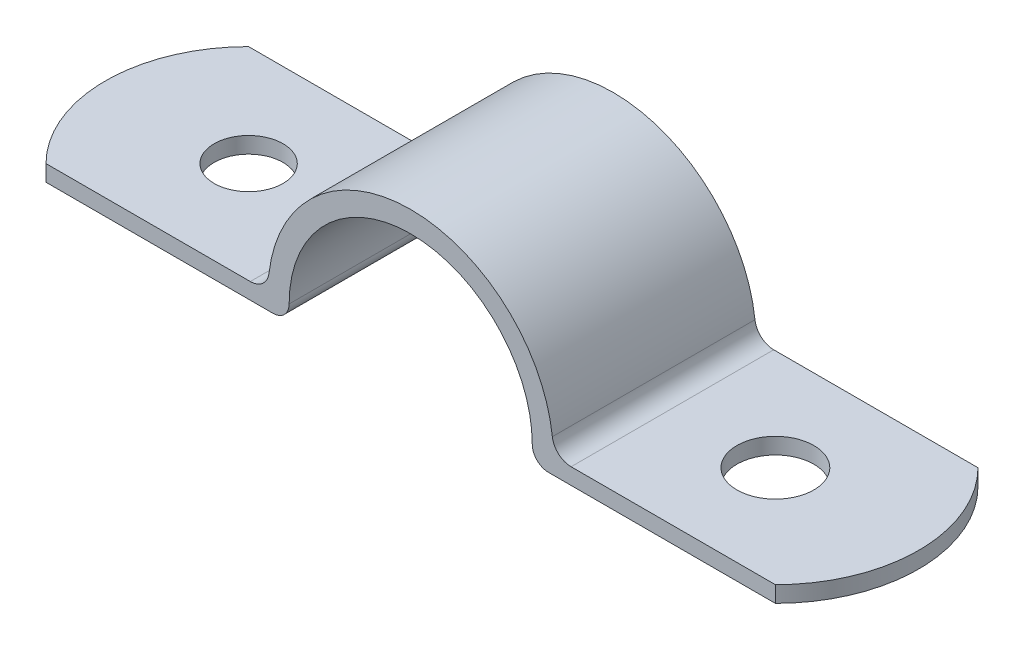
ISO-10303-21;
HEADER;
FILE_DESCRIPTION(('STEP AP214'),'2;1');
FILE_NAME('part.step','',(''),(''),'','','');
FILE_SCHEMA(('AUTOMOTIVE_DESIGN { 1 0 10303 214 1 1 1 1 }'));
ENDSEC;
DATA;
#1=APPLICATION_CONTEXT('core data for automotive mechanical design processes');
#2=APPLICATION_PROTOCOL_DEFINITION('international standard','automotive_design',2000,#1);
#3=PRODUCT_CONTEXT('',#1,'mechanical');
#4=PRODUCT('Part','Part','',(#3));
#5=PRODUCT_RELATED_PRODUCT_CATEGORY('part','',(#4));
#6=PRODUCT_DEFINITION_FORMATION('','',#4);
#7=PRODUCT_DEFINITION_CONTEXT('part definition',#1,'design');
#8=PRODUCT_DEFINITION('design','',#6,#7);
#9=PRODUCT_DEFINITION_SHAPE('','',#8);
#10=(LENGTH_UNIT() NAMED_UNIT(*) SI_UNIT(.MILLI.,.METRE.));
#11=(NAMED_UNIT(*) PLANE_ANGLE_UNIT() SI_UNIT($,.RADIAN.));
#12=(NAMED_UNIT(*) SI_UNIT($,.STERADIAN.) SOLID_ANGLE_UNIT());
#13=UNCERTAINTY_MEASURE_WITH_UNIT(LENGTH_MEASURE(1.E-05),#10,'distance_accuracy_value','');
#14=(GEOMETRIC_REPRESENTATION_CONTEXT(3) GLOBAL_UNCERTAINTY_ASSIGNED_CONTEXT((#13)) GLOBAL_UNIT_ASSIGNED_CONTEXT((#10,
#11,#12)) REPRESENTATION_CONTEXT('',''));
#15=CARTESIAN_POINT('',(0.,0.,0.));
#16=DIRECTION('',(0.,0.,1.));
#17=DIRECTION('',(1.,0.,0.));
#18=AXIS2_PLACEMENT_3D('',#15,#16,#17);
#19=CARTESIAN_POINT('',(0.,0.8,10.));
#20=DIRECTION('',(0.,0.,-1.));
#21=DIRECTION('',(-1.,0.,0.));
#22=AXIS2_PLACEMENT_3D('',#19,#20,#21);
#23=PLANE('',#22);
#24=CARTESIAN_POINT('',(24.8,0.8,10.));
#25=DIRECTION('',(0.,0.,1.));
#26=DIRECTION('',(1.,0.,0.));
#27=AXIS2_PLACEMENT_3D('',#24,#25,#26);
#28=CIRCLE('',#27,0.799999999999999);
#29=CARTESIAN_POINT('',(24.,0.8,10.));
#30=VERTEX_POINT('',#29);
#31=CARTESIAN_POINT('',(24.8,0.,10.));
#32=VERTEX_POINT('',#31);
#33=EDGE_CURVE('E142',#30,#32,#28,.T.);
#34=ORIENTED_EDGE('',*,*,#33,.T.);
#35=DIRECTION('',(1.,0.,0.));
#36=VECTOR('',#35,1.);
#37=CARTESIAN_POINT('',(24.,0.,10.));
#38=LINE('',#37,#36);
#39=CARTESIAN_POINT('',(36.,0.,10.));
#40=VERTEX_POINT('',#39);
#41=EDGE_CURVE('E151',#32,#40,#38,.T.);
#42=ORIENTED_EDGE('',*,*,#41,.T.);
#43=DIRECTION('',(0.,-1.,0.));
#44=VECTOR('',#43,1.);
#45=CARTESIAN_POINT('',(36.,0.8,10.));
#46=LINE('',#45,#44);
#47=CARTESIAN_POINT('',(36.,0.8,10.));
#48=VERTEX_POINT('',#47);
#49=EDGE_CURVE('E173',#48,#40,#46,.T.);
#50=ORIENTED_EDGE('',*,*,#49,.F.);
#51=DIRECTION('',(1.,0.,0.));
#52=VECTOR('',#51,1.);
#53=CARTESIAN_POINT('',(24.,0.8,10.));
#54=LINE('',#53,#52);
#55=CARTESIAN_POINT('',(25.9170940435042,0.8,10.));
#56=VERTEX_POINT('',#55);
#57=EDGE_CURVE('E400',#56,#48,#54,.T.);
#58=ORIENTED_EDGE('',*,*,#57,.F.);
#59=CARTESIAN_POINT('',(25.9170940435042,1.73142282864755,10.));
#60=DIRECTION('',(0.,0.,1.));
#61=DIRECTION('',(1.,0.,0.));
#62=AXIS2_PLACEMENT_3D('',#59,#60,#61);
#63=CIRCLE('',#62,0.931422828647555);
#64=CARTESIAN_POINT('',(24.9920508983528,1.62259422333563,10.));
#65=VERTEX_POINT('',#64);
#66=EDGE_CURVE('E176',#65,#56,#63,.T.);
#67=ORIENTED_EDGE('',*,*,#66,.F.);
#68=CARTESIAN_POINT('',(18.,0.8,10.));
#69=DIRECTION('',(0.,0.,1.));
#70=DIRECTION('',(1.,0.,0.));
#71=AXIS2_PLACEMENT_3D('',#68,#69,#70);
#72=CIRCLE('',#71,7.04027251045164);
#73=CARTESIAN_POINT('',(11.0079491016472,1.62259422333562,10.));
#74=VERTEX_POINT('',#73);
#75=EDGE_CURVE('E191',#74,#65,#72,.F.);
#76=ORIENTED_EDGE('',*,*,#75,.F.);
#77=CARTESIAN_POINT('',(10.0829059564958,1.73142282864756,10.));
#78=DIRECTION('',(0.,0.,1.));
#79=DIRECTION('',(1.,0.,0.));
#80=AXIS2_PLACEMENT_3D('',#77,#78,#79);
#81=CIRCLE('',#80,0.931422828647555);
#82=CARTESIAN_POINT('',(10.0829059564958,0.8,10.));
#83=VERTEX_POINT('',#82);
#84=EDGE_CURVE('E193',#74,#83,#81,.F.);
#85=ORIENTED_EDGE('',*,*,#84,.T.);
#86=DIRECTION('',(1.,0.,0.));
#87=VECTOR('',#86,1.);
#88=CARTESIAN_POINT('',(0.,0.8,10.));
#89=LINE('',#88,#87);
#90=CARTESIAN_POINT('',(0.,0.8,10.));
#91=VERTEX_POINT('',#90);
#92=EDGE_CURVE('E53',#91,#83,#89,.T.);
#93=ORIENTED_EDGE('',*,*,#92,.F.);
#94=DIRECTION('',(0.,-1.,0.));
#95=VECTOR('',#94,1.);
#96=CARTESIAN_POINT('',(0.,0.8,10.));
#97=LINE('',#96,#95);
#98=CARTESIAN_POINT('',(0.,0.,10.));
#99=VERTEX_POINT('',#98);
#100=EDGE_CURVE('E11',#91,#99,#97,.T.);
#101=ORIENTED_EDGE('',*,*,#100,.T.);
#102=DIRECTION('',(1.,0.,0.));
#103=VECTOR('',#102,1.);
#104=CARTESIAN_POINT('',(0.,0.,10.));
#105=LINE('',#104,#103);
#106=CARTESIAN_POINT('',(11.2,0.,10.));
#107=VERTEX_POINT('',#106);
#108=EDGE_CURVE('E222',#99,#107,#105,.T.);
#109=ORIENTED_EDGE('',*,*,#108,.T.);
#110=CARTESIAN_POINT('',(11.2,0.8,10.));
#111=DIRECTION('',(0.,0.,-1.));
#112=DIRECTION('',(-1.,0.,0.));
#113=AXIS2_PLACEMENT_3D('',#110,#111,#112);
#114=CIRCLE('',#113,0.799999999999999);
#115=CARTESIAN_POINT('',(12.,0.799999999999959,10.));
#116=VERTEX_POINT('',#115);
#117=EDGE_CURVE('E152',#116,#107,#114,.T.);
#118=ORIENTED_EDGE('',*,*,#117,.F.);
#119=CARTESIAN_POINT('',(18.,0.8,10.));
#120=DIRECTION('',(0.,0.,1.));
#121=DIRECTION('',(1.,0.,0.));
#122=AXIS2_PLACEMENT_3D('',#119,#120,#121);
#123=CIRCLE('',#122,6.);
#124=EDGE_CURVE('E181',#30,#116,#123,.T.);
#125=ORIENTED_EDGE('',*,*,#124,.F.);
#126=EDGE_LOOP('',(#34,#42,#50,#58,#67,#76,#85,#93,#101,#109,#118,#125));
#127=FACE_BOUND('',#126,.T.);
#128=ADVANCED_FACE('F38',(#127),#23,.F.);
#129=CARTESIAN_POINT('',(12.,0.8,0.));
#130=DIRECTION('',(0.,0.,1.));
#131=DIRECTION('',(1.,0.,0.));
#132=AXIS2_PLACEMENT_3D('',#129,#130,#131);
#133=PLANE('',#132);
#134=CARTESIAN_POINT('',(24.8,0.8,0.));
#135=DIRECTION('',(0.,0.,1.));
#136=DIRECTION('',(1.,0.,0.));
#137=AXIS2_PLACEMENT_3D('',#134,#135,#136);
#138=CIRCLE('',#137,0.799999999999999);
#139=CARTESIAN_POINT('',(24.,0.8,0.));
#140=VERTEX_POINT('',#139);
#141=CARTESIAN_POINT('',(24.8,0.,0.));
#142=VERTEX_POINT('',#141);
#143=EDGE_CURVE('E132',#140,#142,#138,.T.);
#144=ORIENTED_EDGE('',*,*,#143,.F.);
#145=CARTESIAN_POINT('',(18.,0.8,0.));
#146=DIRECTION('',(0.,0.,1.));
#147=DIRECTION('',(1.,0.,0.));
#148=AXIS2_PLACEMENT_3D('',#145,#146,#147);
#149=CIRCLE('',#148,6.);
#150=CARTESIAN_POINT('',(12.,0.8,0.));
#151=VERTEX_POINT('',#150);
#152=EDGE_CURVE('E186',#140,#151,#149,.T.);
#153=ORIENTED_EDGE('',*,*,#152,.T.);
#154=CARTESIAN_POINT('',(11.2,0.8,0.));
#155=DIRECTION('',(0.,0.,-1.));
#156=DIRECTION('',(-1.,0.,0.));
#157=AXIS2_PLACEMENT_3D('',#154,#155,#156);
#158=CIRCLE('',#157,0.799999999999999);
#159=CARTESIAN_POINT('',(11.2,0.,0.));
#160=VERTEX_POINT('',#159);
#161=EDGE_CURVE('E393',#151,#160,#158,.T.);
#162=ORIENTED_EDGE('',*,*,#161,.T.);
#163=DIRECTION('',(-1.,0.,0.));
#164=VECTOR('',#163,1.);
#165=CARTESIAN_POINT('',(12.,0.,0.));
#166=LINE('',#165,#164);
#167=CARTESIAN_POINT('',(0.,0.,0.));
#168=VERTEX_POINT('',#167);
#169=EDGE_CURVE('E74',#160,#168,#166,.T.);
#170=ORIENTED_EDGE('',*,*,#169,.T.);
#171=DIRECTION('',(0.,-1.,0.));
#172=VECTOR('',#171,1.);
#173=CARTESIAN_POINT('',(0.,0.8,0.));
#174=LINE('',#173,#172);
#175=CARTESIAN_POINT('',(0.,0.8,0.));
#176=VERTEX_POINT('',#175);
#177=EDGE_CURVE('E46',#176,#168,#174,.T.);
#178=ORIENTED_EDGE('',*,*,#177,.F.);
#179=DIRECTION('',(-1.,0.,0.));
#180=VECTOR('',#179,1.);
#181=CARTESIAN_POINT('',(12.,0.8,0.));
#182=LINE('',#181,#180);
#183=CARTESIAN_POINT('',(10.0829059564958,0.8,0.));
#184=VERTEX_POINT('',#183);
#185=EDGE_CURVE('E59',#184,#176,#182,.T.);
#186=ORIENTED_EDGE('',*,*,#185,.F.);
#187=CARTESIAN_POINT('',(10.0829059564958,1.73142282864756,0.));
#188=DIRECTION('',(0.,0.,1.));
#189=DIRECTION('',(1.,0.,0.));
#190=AXIS2_PLACEMENT_3D('',#187,#188,#189);
#191=CIRCLE('',#190,0.931422828647555);
#192=CARTESIAN_POINT('',(11.0079491016472,1.62259422333562,0.));
#193=VERTEX_POINT('',#192);
#194=EDGE_CURVE('E183',#193,#184,#191,.F.);
#195=ORIENTED_EDGE('',*,*,#194,.F.);
#196=CARTESIAN_POINT('',(18.,0.8,0.));
#197=DIRECTION('',(0.,0.,1.));
#198=DIRECTION('',(1.,0.,0.));
#199=AXIS2_PLACEMENT_3D('',#196,#197,#198);
#200=CIRCLE('',#199,7.04027251045164);
#201=CARTESIAN_POINT('',(24.9920508983528,1.62259422333563,0.));
#202=VERTEX_POINT('',#201);
#203=EDGE_CURVE('E180',#193,#202,#200,.F.);
#204=ORIENTED_EDGE('',*,*,#203,.T.);
#205=CARTESIAN_POINT('',(25.9170940435042,1.73142282864755,0.));
#206=DIRECTION('',(0.,0.,1.));
#207=DIRECTION('',(1.,0.,0.));
#208=AXIS2_PLACEMENT_3D('',#205,#206,#207);
#209=CIRCLE('',#208,0.931422828647555);
#210=CARTESIAN_POINT('',(25.9170940435042,0.8,0.));
#211=VERTEX_POINT('',#210);
#212=EDGE_CURVE('E177',#202,#211,#209,.T.);
#213=ORIENTED_EDGE('',*,*,#212,.T.);
#214=DIRECTION('',(-1.,0.,0.));
#215=VECTOR('',#214,1.);
#216=CARTESIAN_POINT('',(24.,0.8,0.));
#217=LINE('',#216,#215);
#218=CARTESIAN_POINT('',(36.,0.8,0.));
#219=VERTEX_POINT('',#218);
#220=EDGE_CURVE('E171',#219,#211,#217,.T.);
#221=ORIENTED_EDGE('',*,*,#220,.F.);
#222=DIRECTION('',(0.,-1.,0.));
#223=VECTOR('',#222,1.);
#224=CARTESIAN_POINT('',(36.,0.8,0.));
#225=LINE('',#224,#223);
#226=CARTESIAN_POINT('',(36.,0.,0.));
#227=VERTEX_POINT('',#226);
#228=EDGE_CURVE('E158',#219,#227,#225,.T.);
#229=ORIENTED_EDGE('',*,*,#228,.T.);
#230=DIRECTION('',(-1.,0.,0.));
#231=VECTOR('',#230,1.);
#232=CARTESIAN_POINT('',(24.,0.,0.));
#233=LINE('',#232,#231);
#234=EDGE_CURVE('E150',#227,#142,#233,.T.);
#235=ORIENTED_EDGE('',*,*,#234,.T.);
#236=EDGE_LOOP('',(#144,#153,#162,#170,#178,#186,#195,#204,#213,#221,#229,#235));
#237=FACE_BOUND('',#236,.T.);
#238=ADVANCED_FACE('F155',(#237),#133,.F.);
#239=CARTESIAN_POINT('',(5.,0.8,5.));
#240=DIRECTION('',(0.,-1.,0.));
#241=DIRECTION('',(0.,0.,-1.));
#242=AXIS2_PLACEMENT_3D('',#239,#240,#241);
#243=PLANE('',#242);
#244=ORIENTED_EDGE('',*,*,#92,.T.);
#245=DIRECTION('',(0.,0.,1.));
#246=VECTOR('',#245,1.);
#247=CARTESIAN_POINT('',(10.0829059564958,0.8,0.));
#248=LINE('',#247,#246);
#249=EDGE_CURVE('E201',#184,#83,#248,.T.);
#250=ORIENTED_EDGE('',*,*,#249,.F.);
#251=ORIENTED_EDGE('',*,*,#185,.T.);
#252=CARTESIAN_POINT('',(5.,0.8,5.));
#253=DIRECTION('',(0.,1.,0.));
#254=DIRECTION('',(0.,0.,-1.));
#255=AXIS2_PLACEMENT_3D('',#252,#253,#254);
#256=CIRCLE('',#255,7.07106781186548);
#257=EDGE_CURVE('E213',#176,#91,#256,.T.);
#258=ORIENTED_EDGE('',*,*,#257,.T.);
#259=EDGE_LOOP('',(#244,#250,#251,#258));
#260=FACE_BOUND('',#259,.T.);
#261=CARTESIAN_POINT('',(5.,0.8,5.));
#262=DIRECTION('',(0.,1.,0.));
#263=DIRECTION('',(0.,0.,1.));
#264=AXIS2_PLACEMENT_3D('',#261,#262,#263);
#265=CIRCLE('',#264,1.7);
#266=CARTESIAN_POINT('',(5.,0.8,6.7));
#267=VERTEX_POINT('',#266);
#268=EDGE_CURVE('E207',#267,#267,#265,.T.);
#269=ORIENTED_EDGE('',*,*,#268,.F.);
#270=EDGE_LOOP('',(#269));
#271=FACE_BOUND('',#270,.T.);
#272=ADVANCED_FACE('F240',(#260,#271),#243,.F.);
#273=CARTESIAN_POINT('',(5.,0.,5.));
#274=DIRECTION('',(0.,-1.,0.));
#275=DIRECTION('',(0.,0.,-1.));
#276=AXIS2_PLACEMENT_3D('',#273,#274,#275);
#277=PLANE('',#276);
#278=DIRECTION('',(0.,0.,1.));
#279=VECTOR('',#278,1.);
#280=CARTESIAN_POINT('',(11.2,0.,0.));
#281=LINE('',#280,#279);
#282=EDGE_CURVE('E233',#160,#107,#281,.T.);
#283=ORIENTED_EDGE('',*,*,#282,.T.);
#284=ORIENTED_EDGE('',*,*,#108,.F.);
#285=CARTESIAN_POINT('',(5.,0.,5.));
#286=DIRECTION('',(0.,1.,0.));
#287=DIRECTION('',(0.,0.,-1.));
#288=AXIS2_PLACEMENT_3D('',#285,#286,#287);
#289=CIRCLE('',#288,7.07106781186548);
#290=EDGE_CURVE('E210',#168,#99,#289,.T.);
#291=ORIENTED_EDGE('',*,*,#290,.F.);
#292=ORIENTED_EDGE('',*,*,#169,.F.);
#293=EDGE_LOOP('',(#283,#284,#291,#292));
#294=FACE_BOUND('',#293,.T.);
#295=CARTESIAN_POINT('',(5.,0.,5.));
#296=DIRECTION('',(0.,1.,0.));
#297=DIRECTION('',(0.,0.,1.));
#298=AXIS2_PLACEMENT_3D('',#295,#296,#297);
#299=CIRCLE('',#298,1.7);
#300=CARTESIAN_POINT('',(5.,0.,6.7));
#301=VERTEX_POINT('',#300);
#302=EDGE_CURVE('E199',#301,#301,#299,.T.);
#303=ORIENTED_EDGE('',*,*,#302,.T.);
#304=EDGE_LOOP('',(#303));
#305=FACE_BOUND('',#304,.T.);
#306=ADVANCED_FACE('F231',(#294,#305),#277,.T.);
#307=CARTESIAN_POINT('',(5.,0.8,5.));
#308=DIRECTION('',(0.,-1.,0.));
#309=DIRECTION('',(0.,0.,-1.));
#310=AXIS2_PLACEMENT_3D('',#307,#308,#309);
#311=CYLINDRICAL_SURFACE('',#310,7.07106781186548);
#312=ORIENTED_EDGE('',*,*,#290,.T.);
#313=ORIENTED_EDGE('',*,*,#100,.F.);
#314=ORIENTED_EDGE('',*,*,#257,.F.);
#315=ORIENTED_EDGE('',*,*,#177,.T.);
#316=EDGE_LOOP('',(#312,#313,#314,#315));
#317=FACE_BOUND('',#316,.T.);
#318=ADVANCED_FACE('F40',(#317),#311,.T.);
#319=CARTESIAN_POINT('',(5.,0.8,5.));
#320=DIRECTION('',(0.,-1.,0.));
#321=DIRECTION('',(0.,0.,-1.));
#322=AXIS2_PLACEMENT_3D('',#319,#320,#321);
#323=CYLINDRICAL_SURFACE('',#322,1.7);
#324=ORIENTED_EDGE('',*,*,#268,.T.);
#325=EDGE_LOOP('',(#324));
#326=FACE_BOUND('',#325,.T.);
#327=ORIENTED_EDGE('',*,*,#302,.F.);
#328=EDGE_LOOP('',(#327));
#329=FACE_BOUND('',#328,.T.);
#330=ADVANCED_FACE('F247',(#326,#329),#323,.F.);
#331=CARTESIAN_POINT('',(25.9170940435042,1.73142282864755,0.));
#332=DIRECTION('',(0.,0.,1.));
#333=DIRECTION('',(1.,0.,0.));
#334=AXIS2_PLACEMENT_3D('',#331,#332,#333);
#335=CYLINDRICAL_SURFACE('',#334,0.931422828647555);
#336=ORIENTED_EDGE('',*,*,#66,.T.);
#337=DIRECTION('',(0.,0.,1.));
#338=VECTOR('',#337,1.);
#339=CARTESIAN_POINT('',(25.9170940435042,0.8,0.));
#340=LINE('',#339,#338);
#341=EDGE_CURVE('E197',#211,#56,#340,.T.);
#342=ORIENTED_EDGE('',*,*,#341,.F.);
#343=ORIENTED_EDGE('',*,*,#212,.F.);
#344=DIRECTION('',(0.,0.,1.));
#345=VECTOR('',#344,1.);
#346=CARTESIAN_POINT('',(24.9920508983528,1.62259422333563,0.));
#347=LINE('',#346,#345);
#348=EDGE_CURVE('E188',#202,#65,#347,.T.);
#349=ORIENTED_EDGE('',*,*,#348,.T.);
#350=EDGE_LOOP('',(#336,#342,#343,#349));
#351=FACE_BOUND('',#350,.T.);
#352=ADVANCED_FACE('F250',(#351),#335,.F.);
#353=CARTESIAN_POINT('',(18.,0.8,0.));
#354=DIRECTION('',(0.,0.,1.));
#355=DIRECTION('',(1.,0.,0.));
#356=AXIS2_PLACEMENT_3D('',#353,#354,#355);
#357=CYLINDRICAL_SURFACE('',#356,6.);
#358=ORIENTED_EDGE('',*,*,#124,.T.);
#359=DIRECTION('',(0.,0.,-1.));
#360=VECTOR('',#359,1.);
#361=CARTESIAN_POINT('',(12.,0.8,10.));
#362=LINE('',#361,#360);
#363=EDGE_CURVE('E216',#116,#151,#362,.T.);
#364=ORIENTED_EDGE('',*,*,#363,.T.);
#365=ORIENTED_EDGE('',*,*,#152,.F.);
#366=DIRECTION('',(0.,0.,1.));
#367=VECTOR('',#366,1.);
#368=CARTESIAN_POINT('',(24.,0.8,0.));
#369=LINE('',#368,#367);
#370=EDGE_CURVE('E138',#140,#30,#369,.T.);
#371=ORIENTED_EDGE('',*,*,#370,.T.);
#372=EDGE_LOOP('',(#358,#364,#365,#371));
#373=FACE_BOUND('',#372,.T.);
#374=ADVANCED_FACE('F254',(#373),#357,.F.);
#375=CARTESIAN_POINT('',(10.0829059564958,1.73142282864756,0.));
#376=DIRECTION('',(0.,0.,1.));
#377=DIRECTION('',(1.,0.,0.));
#378=AXIS2_PLACEMENT_3D('',#375,#376,#377);
#379=CYLINDRICAL_SURFACE('',#378,0.931422828647555);
#380=ORIENTED_EDGE('',*,*,#84,.F.);
#381=DIRECTION('',(0.,0.,1.));
#382=VECTOR('',#381,1.);
#383=CARTESIAN_POINT('',(11.0079491016472,1.62259422333562,0.));
#384=LINE('',#383,#382);
#385=EDGE_CURVE('E203',#193,#74,#384,.T.);
#386=ORIENTED_EDGE('',*,*,#385,.F.);
#387=ORIENTED_EDGE('',*,*,#194,.T.);
#388=ORIENTED_EDGE('',*,*,#249,.T.);
#389=EDGE_LOOP('',(#380,#386,#387,#388));
#390=FACE_BOUND('',#389,.T.);
#391=ADVANCED_FACE('F260',(#390),#379,.F.);
#392=CARTESIAN_POINT('',(18.,0.8,0.));
#393=DIRECTION('',(0.,0.,1.));
#394=DIRECTION('',(1.,0.,0.));
#395=AXIS2_PLACEMENT_3D('',#392,#393,#394);
#396=CYLINDRICAL_SURFACE('',#395,7.04027251045164);
#397=ORIENTED_EDGE('',*,*,#75,.T.);
#398=ORIENTED_EDGE('',*,*,#348,.F.);
#399=ORIENTED_EDGE('',*,*,#203,.F.);
#400=ORIENTED_EDGE('',*,*,#385,.T.);
#401=EDGE_LOOP('',(#397,#398,#399,#400));
#402=FACE_BOUND('',#401,.T.);
#403=ADVANCED_FACE('F256',(#402),#396,.T.);
#404=CARTESIAN_POINT('',(31.,0.8,5.));
#405=DIRECTION('',(0.,-1.,0.));
#406=DIRECTION('',(0.,0.,-1.));
#407=AXIS2_PLACEMENT_3D('',#404,#405,#406);
#408=PLANE('',#407);
#409=ORIENTED_EDGE('',*,*,#341,.T.);
#410=ORIENTED_EDGE('',*,*,#57,.T.);
#411=CARTESIAN_POINT('',(31.,0.8,5.));
#412=DIRECTION('',(0.,1.,0.));
#413=DIRECTION('',(0.,0.,-1.));
#414=AXIS2_PLACEMENT_3D('',#411,#412,#413);
#415=CIRCLE('',#414,7.07106781186548);
#416=EDGE_CURVE('E167',#48,#219,#415,.T.);
#417=ORIENTED_EDGE('',*,*,#416,.T.);
#418=ORIENTED_EDGE('',*,*,#220,.T.);
#419=EDGE_LOOP('',(#409,#410,#417,#418));
#420=FACE_BOUND('',#419,.T.);
#421=CARTESIAN_POINT('',(31.,0.8,5.));
#422=DIRECTION('',(0.,1.,0.));
#423=DIRECTION('',(0.,0.,1.));
#424=AXIS2_PLACEMENT_3D('',#421,#422,#423);
#425=CIRCLE('',#424,1.90000000000001);
#426=CARTESIAN_POINT('',(31.,0.8,6.90000000000001));
#427=VERTEX_POINT('',#426);
#428=EDGE_CURVE('E159',#427,#427,#425,.T.);
#429=ORIENTED_EDGE('',*,*,#428,.F.);
#430=EDGE_LOOP('',(#429));
#431=FACE_BOUND('',#430,.T.);
#432=ADVANCED_FACE('F259',(#420,#431),#408,.F.);
#433=CARTESIAN_POINT('',(31.,0.,5.));
#434=DIRECTION('',(0.,-1.,0.));
#435=DIRECTION('',(0.,0.,-1.));
#436=AXIS2_PLACEMENT_3D('',#433,#434,#435);
#437=PLANE('',#436);
#438=DIRECTION('',(0.,0.,1.));
#439=VECTOR('',#438,1.);
#440=CARTESIAN_POINT('',(24.8,0.,0.));
#441=LINE('',#440,#439);
#442=EDGE_CURVE('E135',#142,#32,#441,.T.);
#443=ORIENTED_EDGE('',*,*,#442,.F.);
#444=ORIENTED_EDGE('',*,*,#234,.F.);
#445=CARTESIAN_POINT('',(31.,0.,5.));
#446=DIRECTION('',(0.,1.,0.));
#447=DIRECTION('',(0.,0.,-1.));
#448=AXIS2_PLACEMENT_3D('',#445,#446,#447);
#449=CIRCLE('',#448,7.07106781186548);
#450=EDGE_CURVE('E161',#40,#227,#449,.T.);
#451=ORIENTED_EDGE('',*,*,#450,.F.);
#452=ORIENTED_EDGE('',*,*,#41,.F.);
#453=EDGE_LOOP('',(#443,#444,#451,#452));
#454=FACE_BOUND('',#453,.T.);
#455=CARTESIAN_POINT('',(31.,0.,5.));
#456=DIRECTION('',(0.,1.,0.));
#457=DIRECTION('',(0.,0.,1.));
#458=AXIS2_PLACEMENT_3D('',#455,#456,#457);
#459=CIRCLE('',#458,1.90000000000001);
#460=CARTESIAN_POINT('',(31.,0.,6.90000000000001));
#461=VERTEX_POINT('',#460);
#462=EDGE_CURVE('E164',#461,#461,#459,.T.);
#463=ORIENTED_EDGE('',*,*,#462,.T.);
#464=EDGE_LOOP('',(#463));
#465=FACE_BOUND('',#464,.T.);
#466=ADVANCED_FACE('F147',(#454,#465),#437,.T.);
#467=CARTESIAN_POINT('',(31.,0.8,5.));
#468=DIRECTION('',(0.,-1.,0.));
#469=DIRECTION('',(0.,0.,-1.));
#470=AXIS2_PLACEMENT_3D('',#467,#468,#469);
#471=CYLINDRICAL_SURFACE('',#470,7.07106781186548);
#472=ORIENTED_EDGE('',*,*,#450,.T.);
#473=ORIENTED_EDGE('',*,*,#228,.F.);
#474=ORIENTED_EDGE('',*,*,#416,.F.);
#475=ORIENTED_EDGE('',*,*,#49,.T.);
#476=EDGE_LOOP('',(#472,#473,#474,#475));
#477=FACE_BOUND('',#476,.T.);
#478=ADVANCED_FACE('F268',(#477),#471,.T.);
#479=CARTESIAN_POINT('',(31.,0.8,5.));
#480=DIRECTION('',(0.,-1.,0.));
#481=DIRECTION('',(0.,0.,-1.));
#482=AXIS2_PLACEMENT_3D('',#479,#480,#481);
#483=CYLINDRICAL_SURFACE('',#482,1.90000000000001);
#484=ORIENTED_EDGE('',*,*,#428,.T.);
#485=EDGE_LOOP('',(#484));
#486=FACE_BOUND('',#485,.T.);
#487=ORIENTED_EDGE('',*,*,#462,.F.);
#488=EDGE_LOOP('',(#487));
#489=FACE_BOUND('',#488,.T.);
#490=ADVANCED_FACE('F271',(#486,#489),#483,.F.);
#491=CARTESIAN_POINT('',(11.2,0.8,0.));
#492=DIRECTION('',(0.,0.,1.));
#493=DIRECTION('',(1.,0.,0.));
#494=AXIS2_PLACEMENT_3D('',#491,#492,#493);
#495=CYLINDRICAL_SURFACE('',#494,0.799999999999999);
#496=ORIENTED_EDGE('',*,*,#117,.T.);
#497=ORIENTED_EDGE('',*,*,#282,.F.);
#498=ORIENTED_EDGE('',*,*,#161,.F.);
#499=ORIENTED_EDGE('',*,*,#363,.F.);
#500=EDGE_LOOP('',(#496,#497,#498,#499));
#501=FACE_BOUND('',#500,.T.);
#502=ADVANCED_FACE('F280',(#501),#495,.T.);
#503=CARTESIAN_POINT('',(24.8,0.8,0.));
#504=DIRECTION('',(0.,0.,1.));
#505=DIRECTION('',(1.,0.,0.));
#506=AXIS2_PLACEMENT_3D('',#503,#504,#505);
#507=CYLINDRICAL_SURFACE('',#506,0.799999999999999);
#508=ORIENTED_EDGE('',*,*,#33,.F.);
#509=ORIENTED_EDGE('',*,*,#370,.F.);
#510=ORIENTED_EDGE('',*,*,#143,.T.);
#511=ORIENTED_EDGE('',*,*,#442,.T.);
#512=EDGE_LOOP('',(#508,#509,#510,#511));
#513=FACE_BOUND('',#512,.T.);
#514=ADVANCED_FACE('F134',(#513),#507,.T.);
#515=CLOSED_SHELL('',(#128,#238,#272,#306,#318,#330,#352,#374,#391,#403,#432,#466,#478,#490,
#502,#514));
#516=MANIFOLD_SOLID_BREP('B2',#515);
#517=ADVANCED_BREP_SHAPE_REPRESENTATION('',(#18,#516),#14);
#518=SHAPE_DEFINITION_REPRESENTATION(#9,#517);
ENDSEC;
END-ISO-10303-21;
